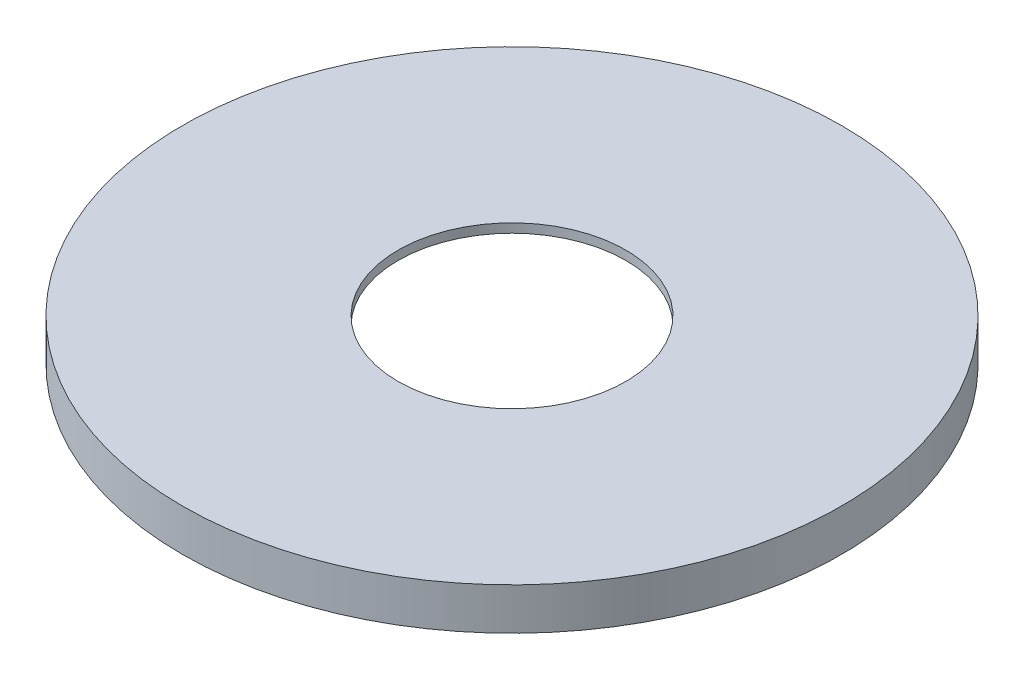
ISO-10303-21;
HEADER;
FILE_DESCRIPTION(('STEP AP214'),'2;1');
FILE_NAME('part.step','',(''),(''),'','','');
FILE_SCHEMA(('AUTOMOTIVE_DESIGN { 1 0 10303 214 1 1 1 1 }'));
ENDSEC;
DATA;
#1=APPLICATION_CONTEXT('core data for automotive mechanical design processes');
#2=APPLICATION_PROTOCOL_DEFINITION('international standard','automotive_design',2000,#1);
#3=PRODUCT_CONTEXT('',#1,'mechanical');
#4=PRODUCT('Part','Part','',(#3));
#5=PRODUCT_RELATED_PRODUCT_CATEGORY('part','',(#4));
#6=PRODUCT_DEFINITION_FORMATION('','',#4);
#7=PRODUCT_DEFINITION_CONTEXT('part definition',#1,'design');
#8=PRODUCT_DEFINITION('design','',#6,#7);
#9=PRODUCT_DEFINITION_SHAPE('','',#8);
#10=(LENGTH_UNIT() NAMED_UNIT(*) SI_UNIT(.MILLI.,.METRE.));
#11=(NAMED_UNIT(*) PLANE_ANGLE_UNIT() SI_UNIT($,.RADIAN.));
#12=(NAMED_UNIT(*) SI_UNIT($,.STERADIAN.) SOLID_ANGLE_UNIT());
#13=UNCERTAINTY_MEASURE_WITH_UNIT(LENGTH_MEASURE(1.E-05),#10,'distance_accuracy_value','');
#14=(GEOMETRIC_REPRESENTATION_CONTEXT(3) GLOBAL_UNCERTAINTY_ASSIGNED_CONTEXT((#13)) GLOBAL_UNIT_ASSIGNED_CONTEXT((#10,
#11,#12)) REPRESENTATION_CONTEXT('',''));
#15=CARTESIAN_POINT('',(0.,0.,0.));
#16=DIRECTION('',(0.,0.,1.));
#17=DIRECTION('',(1.,0.,0.));
#18=AXIS2_PLACEMENT_3D('',#15,#16,#17);
#19=CARTESIAN_POINT('',(0.,7.,0.));
#20=DIRECTION('',(0.,-1.,0.));
#21=DIRECTION('',(0.,0.,-1.));
#22=AXIS2_PLACEMENT_3D('',#19,#20,#21);
#23=CYLINDRICAL_SURFACE('',#22,55.);
#24=CARTESIAN_POINT('',(0.,7.,0.));
#25=DIRECTION('',(0.,1.,0.));
#26=DIRECTION('',(0.,0.,1.));
#27=AXIS2_PLACEMENT_3D('',#24,#25,#26);
#28=CIRCLE('',#27,55.);
#29=CARTESIAN_POINT('',(0.,7.,55.));
#30=VERTEX_POINT('',#29);
#31=EDGE_CURVE('E10',#30,#30,#28,.T.);
#32=ORIENTED_EDGE('',*,*,#31,.F.);
#33=EDGE_LOOP('',(#32));
#34=FACE_BOUND('',#33,.T.);
#35=CARTESIAN_POINT('',(0.,0.,0.));
#36=DIRECTION('',(0.,1.,0.));
#37=DIRECTION('',(0.,0.,1.));
#38=AXIS2_PLACEMENT_3D('',#35,#36,#37);
#39=CIRCLE('',#38,55.);
#40=CARTESIAN_POINT('',(0.,0.,55.));
#41=VERTEX_POINT('',#40);
#42=EDGE_CURVE('E34',#41,#41,#39,.T.);
#43=ORIENTED_EDGE('',*,*,#42,.T.);
#44=EDGE_LOOP('',(#43));
#45=FACE_BOUND('',#44,.T.);
#46=ADVANCED_FACE('F31',(#34,#45),#23,.T.);
#47=CARTESIAN_POINT('',(0.,7.,0.));
#48=DIRECTION('',(0.,1.,0.));
#49=DIRECTION('',(0.,0.,1.));
#50=AXIS2_PLACEMENT_3D('',#47,#48,#49);
#51=PLANE('',#50);
#52=CARTESIAN_POINT('',(0.,7.,0.));
#53=DIRECTION('',(0.,1.,0.));
#54=DIRECTION('',(0.,0.,1.));
#55=AXIS2_PLACEMENT_3D('',#52,#53,#54);
#56=CIRCLE('',#55,19.);
#57=CARTESIAN_POINT('',(0.,7.,19.));
#58=VERTEX_POINT('',#57);
#59=EDGE_CURVE('E46',#58,#58,#56,.T.);
#60=ORIENTED_EDGE('',*,*,#59,.F.);
#61=EDGE_LOOP('',(#60));
#62=FACE_BOUND('',#61,.T.);
#63=ORIENTED_EDGE('',*,*,#31,.T.);
#64=EDGE_LOOP('',(#63));
#65=FACE_BOUND('',#64,.T.);
#66=ADVANCED_FACE('F57',(#62,#65),#51,.T.);
#67=CARTESIAN_POINT('',(0.,0.,0.));
#68=DIRECTION('',(0.,1.,0.));
#69=DIRECTION('',(0.,0.,1.));
#70=AXIS2_PLACEMENT_3D('',#67,#68,#69);
#71=PLANE('',#70);
#72=CARTESIAN_POINT('',(0.,0.,0.));
#73=DIRECTION('',(0.,-1.,0.));
#74=DIRECTION('',(0.,0.,-1.));
#75=AXIS2_PLACEMENT_3D('',#72,#73,#74);
#76=CIRCLE('',#75,51.);
#77=CARTESIAN_POINT('',(0.,0.,-51.));
#78=VERTEX_POINT('',#77);
#79=EDGE_CURVE('E43',#78,#78,#76,.T.);
#80=ORIENTED_EDGE('',*,*,#79,.F.);
#81=EDGE_LOOP('',(#80));
#82=FACE_BOUND('',#81,.T.);
#83=ORIENTED_EDGE('',*,*,#42,.F.);
#84=EDGE_LOOP('',(#83));
#85=FACE_BOUND('',#84,.T.);
#86=ADVANCED_FACE('F59',(#82,#85),#71,.F.);
#87=CARTESIAN_POINT('',(0.,5.5,0.));
#88=DIRECTION('',(0.,-1.,0.));
#89=DIRECTION('',(0.,0.,-1.));
#90=AXIS2_PLACEMENT_3D('',#87,#88,#89);
#91=CYLINDRICAL_SURFACE('',#90,51.);
#92=CARTESIAN_POINT('',(0.,5.5,0.));
#93=DIRECTION('',(0.,-1.,0.));
#94=DIRECTION('',(0.,0.,-1.));
#95=AXIS2_PLACEMENT_3D('',#92,#93,#94);
#96=CIRCLE('',#95,51.);
#97=CARTESIAN_POINT('',(0.,5.5,-51.));
#98=VERTEX_POINT('',#97);
#99=EDGE_CURVE('E41',#98,#98,#96,.T.);
#100=ORIENTED_EDGE('',*,*,#99,.F.);
#101=EDGE_LOOP('',(#100));
#102=FACE_BOUND('',#101,.T.);
#103=ORIENTED_EDGE('',*,*,#79,.T.);
#104=EDGE_LOOP('',(#103));
#105=FACE_BOUND('',#104,.T.);
#106=ADVANCED_FACE('F65',(#102,#105),#91,.F.);
#107=CARTESIAN_POINT('',(0.,5.5,0.));
#108=DIRECTION('',(0.,-1.,0.));
#109=DIRECTION('',(0.,0.,-1.));
#110=AXIS2_PLACEMENT_3D('',#107,#108,#109);
#111=PLANE('',#110);
#112=CARTESIAN_POINT('',(0.,5.5,0.));
#113=DIRECTION('',(0.,-1.,0.));
#114=DIRECTION('',(0.,0.,-1.));
#115=AXIS2_PLACEMENT_3D('',#112,#113,#114);
#116=CIRCLE('',#115,19.);
#117=CARTESIAN_POINT('',(0.,5.5,-19.));
#118=VERTEX_POINT('',#117);
#119=EDGE_CURVE('E49',#118,#118,#116,.F.);
#120=ORIENTED_EDGE('',*,*,#119,.T.);
#121=EDGE_LOOP('',(#120));
#122=FACE_BOUND('',#121,.T.);
#123=ORIENTED_EDGE('',*,*,#99,.T.);
#124=EDGE_LOOP('',(#123));
#125=FACE_BOUND('',#124,.T.);
#126=ADVANCED_FACE('F71',(#122,#125),#111,.T.);
#127=CARTESIAN_POINT('',(0.,-0.00100000000000013,0.));
#128=DIRECTION('',(0.,1.,0.));
#129=DIRECTION('',(0.,0.,1.));
#130=AXIS2_PLACEMENT_3D('',#127,#128,#129);
#131=CYLINDRICAL_SURFACE('',#130,19.);
#132=ORIENTED_EDGE('',*,*,#119,.F.);
#133=EDGE_LOOP('',(#132));
#134=FACE_BOUND('',#133,.T.);
#135=ORIENTED_EDGE('',*,*,#59,.T.);
#136=EDGE_LOOP('',(#135));
#137=FACE_BOUND('',#136,.T.);
#138=ADVANCED_FACE('F55',(#134,#137),#131,.F.);
#139=CLOSED_SHELL('',(#46,#66,#86,#106,#126,#138));
#140=MANIFOLD_SOLID_BREP('B2',#139);
#141=ADVANCED_BREP_SHAPE_REPRESENTATION('',(#18,#140),#14);
#142=SHAPE_DEFINITION_REPRESENTATION(#9,#141);
ENDSEC;
END-ISO-10303-21;
